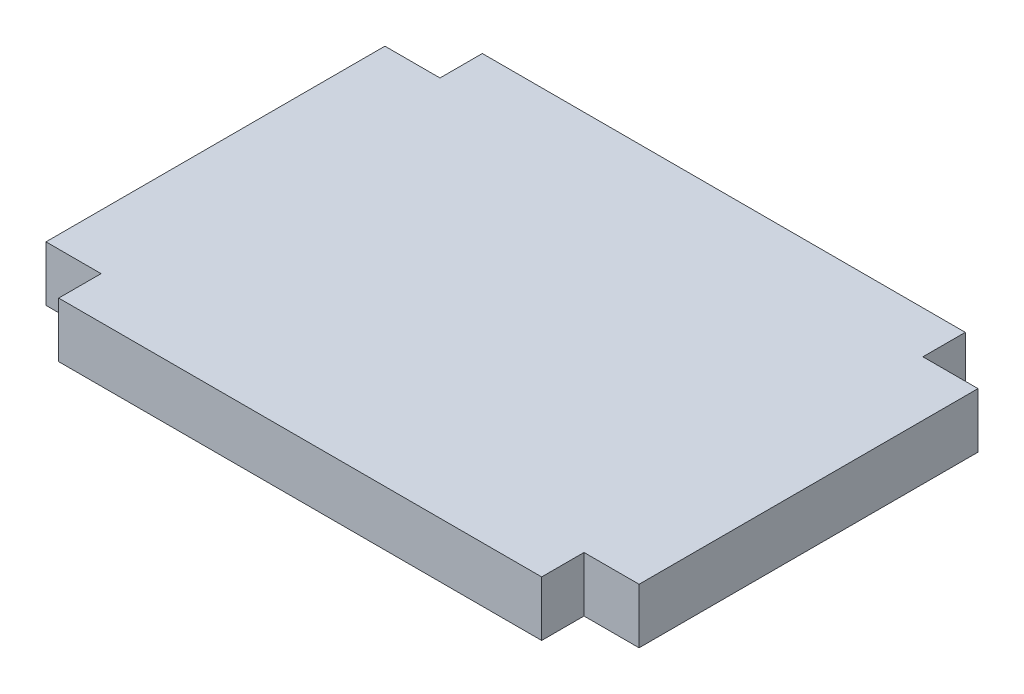
ISO-10303-21;
HEADER;
FILE_DESCRIPTION(('STEP AP214'),'2;1');
FILE_NAME('part.step','',(''),(''),'','','');
FILE_SCHEMA(('AUTOMOTIVE_DESIGN { 1 0 10303 214 1 1 1 1 }'));
ENDSEC;
DATA;
#1=APPLICATION_CONTEXT('core data for automotive mechanical design processes');
#2=APPLICATION_PROTOCOL_DEFINITION('international standard','automotive_design',2000,#1);
#3=PRODUCT_CONTEXT('',#1,'mechanical');
#4=PRODUCT('Part','Part','',(#3));
#5=PRODUCT_RELATED_PRODUCT_CATEGORY('part','',(#4));
#6=PRODUCT_DEFINITION_FORMATION('','',#4);
#7=PRODUCT_DEFINITION_CONTEXT('part definition',#1,'design');
#8=PRODUCT_DEFINITION('design','',#6,#7);
#9=PRODUCT_DEFINITION_SHAPE('','',#8);
#10=(LENGTH_UNIT() NAMED_UNIT(*) SI_UNIT(.MILLI.,.METRE.));
#11=(NAMED_UNIT(*) PLANE_ANGLE_UNIT() SI_UNIT($,.RADIAN.));
#12=(NAMED_UNIT(*) SI_UNIT($,.STERADIAN.) SOLID_ANGLE_UNIT());
#13=UNCERTAINTY_MEASURE_WITH_UNIT(LENGTH_MEASURE(1.E-05),#10,'distance_accuracy_value','');
#14=(GEOMETRIC_REPRESENTATION_CONTEXT(3) GLOBAL_UNCERTAINTY_ASSIGNED_CONTEXT((#13)) GLOBAL_UNIT_ASSIGNED_CONTEXT((#10,
#11,#12)) REPRESENTATION_CONTEXT('',''));
#15=CARTESIAN_POINT('',(0.,0.,0.));
#16=DIRECTION('',(0.,0.,1.));
#17=DIRECTION('',(1.,0.,0.));
#18=AXIS2_PLACEMENT_3D('',#15,#16,#17);
#19=CARTESIAN_POINT('',(5.7,1.3,-5.));
#20=DIRECTION('',(-1.,0.,0.));
#21=DIRECTION('',(0.,0.,1.));
#22=AXIS2_PLACEMENT_3D('',#19,#20,#21);
#23=PLANE('',#22);
#24=DIRECTION('',(0.,1.,0.));
#25=VECTOR('',#24,1.);
#26=CARTESIAN_POINT('',(5.7,0.,-4.));
#27=LINE('',#26,#25);
#28=CARTESIAN_POINT('',(5.7,0.,-4.));
#29=VERTEX_POINT('',#28);
#30=CARTESIAN_POINT('',(5.7,1.3,-4.));
#31=VERTEX_POINT('',#30);
#32=EDGE_CURVE('E133',#29,#31,#27,.T.);
#33=ORIENTED_EDGE('',*,*,#32,.F.);
#34=DIRECTION('',(0.,0.,-1.));
#35=VECTOR('',#34,1.);
#36=CARTESIAN_POINT('',(5.7,0.,-5.));
#37=LINE('',#36,#35);
#38=CARTESIAN_POINT('',(5.7,0.,-5.));
#39=VERTEX_POINT('',#38);
#40=EDGE_CURVE('E186',#29,#39,#37,.T.);
#41=ORIENTED_EDGE('',*,*,#40,.T.);
#42=DIRECTION('',(0.,-1.,0.));
#43=VECTOR('',#42,1.);
#44=CARTESIAN_POINT('',(5.7,1.3,-5.));
#45=LINE('',#44,#43);
#46=CARTESIAN_POINT('',(5.7,1.3,-5.));
#47=VERTEX_POINT('',#46);
#48=EDGE_CURVE('E11',#47,#39,#45,.T.);
#49=ORIENTED_EDGE('',*,*,#48,.F.);
#50=DIRECTION('',(0.,0.,-1.));
#51=VECTOR('',#50,1.);
#52=CARTESIAN_POINT('',(5.7,1.3,-5.));
#53=LINE('',#52,#51);
#54=EDGE_CURVE('E149',#31,#47,#53,.T.);
#55=ORIENTED_EDGE('',*,*,#54,.F.);
#56=EDGE_LOOP('',(#33,#41,#49,#55));
#57=FACE_BOUND('',#56,.T.);
#58=ADVANCED_FACE('F43',(#57),#23,.F.);
#59=CARTESIAN_POINT('',(-5.7,1.3,-5.));
#60=DIRECTION('',(1.,0.,0.));
#61=DIRECTION('',(0.,0.,-1.));
#62=AXIS2_PLACEMENT_3D('',#59,#60,#61);
#63=PLANE('',#62);
#64=DIRECTION('',(0.,1.,0.));
#65=VECTOR('',#64,1.);
#66=CARTESIAN_POINT('',(-5.7,0.,4.));
#67=LINE('',#66,#65);
#68=CARTESIAN_POINT('',(-5.7,0.,4.));
#69=VERTEX_POINT('',#68);
#70=CARTESIAN_POINT('',(-5.7,1.3,4.));
#71=VERTEX_POINT('',#70);
#72=EDGE_CURVE('E238',#69,#71,#67,.T.);
#73=ORIENTED_EDGE('',*,*,#72,.F.);
#74=DIRECTION('',(0.,0.,1.));
#75=VECTOR('',#74,1.);
#76=CARTESIAN_POINT('',(-5.7,0.,-5.));
#77=LINE('',#76,#75);
#78=CARTESIAN_POINT('',(-5.7,0.,5.));
#79=VERTEX_POINT('',#78);
#80=EDGE_CURVE('E189',#69,#79,#77,.T.);
#81=ORIENTED_EDGE('',*,*,#80,.T.);
#82=DIRECTION('',(0.,-1.,0.));
#83=VECTOR('',#82,1.);
#84=CARTESIAN_POINT('',(-5.7,1.3,5.));
#85=LINE('',#84,#83);
#86=CARTESIAN_POINT('',(-5.7,1.3,5.));
#87=VERTEX_POINT('',#86);
#88=EDGE_CURVE('E196',#87,#79,#85,.T.);
#89=ORIENTED_EDGE('',*,*,#88,.F.);
#90=DIRECTION('',(0.,0.,1.));
#91=VECTOR('',#90,1.);
#92=CARTESIAN_POINT('',(-5.7,1.3,-5.));
#93=LINE('',#92,#91);
#94=EDGE_CURVE('E172',#71,#87,#93,.T.);
#95=ORIENTED_EDGE('',*,*,#94,.F.);
#96=EDGE_LOOP('',(#73,#81,#89,#95));
#97=FACE_BOUND('',#96,.T.);
#98=ADVANCED_FACE('F255',(#97),#63,.F.);
#99=CARTESIAN_POINT('',(5.7,0.,5.));
#100=VERTEX_POINT('',#99);
#101=CARTESIAN_POINT('',(5.7,0.,4.));
#102=VERTEX_POINT('',#101);
#103=EDGE_CURVE('E181',#100,#102,#37,.T.);
#104=ORIENTED_EDGE('',*,*,#103,.T.);
#105=DIRECTION('',(0.,1.,0.));
#106=VECTOR('',#105,1.);
#107=CARTESIAN_POINT('',(5.7,0.,4.));
#108=LINE('',#107,#106);
#109=CARTESIAN_POINT('',(5.7,1.3,4.));
#110=VERTEX_POINT('',#109);
#111=EDGE_CURVE('E421',#102,#110,#108,.T.);
#112=ORIENTED_EDGE('',*,*,#111,.T.);
#113=CARTESIAN_POINT('',(5.7,1.3,5.));
#114=VERTEX_POINT('',#113);
#115=EDGE_CURVE('E158',#114,#110,#53,.T.);
#116=ORIENTED_EDGE('',*,*,#115,.F.);
#117=DIRECTION('',(0.,-1.,0.));
#118=VECTOR('',#117,1.);
#119=CARTESIAN_POINT('',(5.7,1.3,5.));
#120=LINE('',#119,#118);
#121=EDGE_CURVE('E180',#114,#100,#120,.T.);
#122=ORIENTED_EDGE('',*,*,#121,.T.);
#123=EDGE_LOOP('',(#104,#112,#116,#122));
#124=FACE_BOUND('',#123,.T.);
#125=ADVANCED_FACE('F45',(#124),#23,.F.);
#126=CARTESIAN_POINT('',(-5.7,1.3,-5.));
#127=DIRECTION('',(0.,0.,1.));
#128=DIRECTION('',(1.,0.,0.));
#129=AXIS2_PLACEMENT_3D('',#126,#127,#128);
#130=PLANE('',#129);
#131=DIRECTION('',(-1.,0.,0.));
#132=VECTOR('',#131,1.);
#133=CARTESIAN_POINT('',(-5.7,0.,-5.));
#134=LINE('',#133,#132);
#135=CARTESIAN_POINT('',(-5.7,0.,-5.));
#136=VERTEX_POINT('',#135);
#137=EDGE_CURVE('E185',#39,#136,#134,.T.);
#138=ORIENTED_EDGE('',*,*,#137,.T.);
#139=DIRECTION('',(0.,-1.,0.));
#140=VECTOR('',#139,1.);
#141=CARTESIAN_POINT('',(-5.7,1.3,-5.));
#142=LINE('',#141,#140);
#143=CARTESIAN_POINT('',(-5.7,1.3,-5.));
#144=VERTEX_POINT('',#143);
#145=EDGE_CURVE('E52',#144,#136,#142,.T.);
#146=ORIENTED_EDGE('',*,*,#145,.F.);
#147=DIRECTION('',(-1.,0.,0.));
#148=VECTOR('',#147,1.);
#149=CARTESIAN_POINT('',(-5.7,1.3,-5.));
#150=LINE('',#149,#148);
#151=EDGE_CURVE('E163',#47,#144,#150,.T.);
#152=ORIENTED_EDGE('',*,*,#151,.F.);
#153=ORIENTED_EDGE('',*,*,#48,.T.);
#154=EDGE_LOOP('',(#138,#146,#152,#153));
#155=FACE_BOUND('',#154,.T.);
#156=ADVANCED_FACE('F247',(#155),#130,.F.);
#157=CARTESIAN_POINT('',(-5.7,0.,-4.));
#158=VERTEX_POINT('',#157);
#159=EDGE_CURVE('E164',#136,#158,#77,.T.);
#160=ORIENTED_EDGE('',*,*,#159,.T.);
#161=DIRECTION('',(0.,1.,0.));
#162=VECTOR('',#161,1.);
#163=CARTESIAN_POINT('',(-5.7,0.,-4.));
#164=LINE('',#163,#162);
#165=CARTESIAN_POINT('',(-5.7,1.3,-4.));
#166=VERTEX_POINT('',#165);
#167=EDGE_CURVE('E168',#158,#166,#164,.T.);
#168=ORIENTED_EDGE('',*,*,#167,.T.);
#169=EDGE_CURVE('E173',#144,#166,#93,.T.);
#170=ORIENTED_EDGE('',*,*,#169,.F.);
#171=ORIENTED_EDGE('',*,*,#145,.T.);
#172=EDGE_LOOP('',(#160,#168,#170,#171));
#173=FACE_BOUND('',#172,.T.);
#174=ADVANCED_FACE('F205',(#173),#63,.F.);
#175=CARTESIAN_POINT('',(-5.7,1.3,5.));
#176=DIRECTION('',(0.,0.,-1.));
#177=DIRECTION('',(-1.,0.,0.));
#178=AXIS2_PLACEMENT_3D('',#175,#176,#177);
#179=PLANE('',#178);
#180=DIRECTION('',(1.,0.,0.));
#181=VECTOR('',#180,1.);
#182=CARTESIAN_POINT('',(-5.7,0.,5.));
#183=LINE('',#182,#181);
#184=EDGE_CURVE('E159',#79,#100,#183,.T.);
#185=ORIENTED_EDGE('',*,*,#184,.T.);
#186=ORIENTED_EDGE('',*,*,#121,.F.);
#187=DIRECTION('',(1.,0.,0.));
#188=VECTOR('',#187,1.);
#189=CARTESIAN_POINT('',(-5.7,1.3,5.));
#190=LINE('',#189,#188);
#191=EDGE_CURVE('E177',#87,#114,#190,.T.);
#192=ORIENTED_EDGE('',*,*,#191,.F.);
#193=ORIENTED_EDGE('',*,*,#88,.T.);
#194=EDGE_LOOP('',(#185,#186,#192,#193));
#195=FACE_BOUND('',#194,.T.);
#196=ADVANCED_FACE('F253',(#195),#179,.F.);
#197=CARTESIAN_POINT('',(0.,1.3,0.));
#198=DIRECTION('',(0.,1.,0.));
#199=DIRECTION('',(0.,0.,1.));
#200=AXIS2_PLACEMENT_3D('',#197,#198,#199);
#201=PLANE('',#200);
#202=ORIENTED_EDGE('',*,*,#115,.T.);
#203=DIRECTION('',(1.,0.,0.));
#204=VECTOR('',#203,1.);
#205=CARTESIAN_POINT('',(5.7,1.3,4.));
#206=LINE('',#205,#204);
#207=CARTESIAN_POINT('',(7.,1.3,4.));
#208=VERTEX_POINT('',#207);
#209=EDGE_CURVE('E59',#110,#208,#206,.T.);
#210=ORIENTED_EDGE('',*,*,#209,.T.);
#211=DIRECTION('',(0.,0.,-1.));
#212=VECTOR('',#211,1.);
#213=CARTESIAN_POINT('',(7.,1.3,-4.));
#214=LINE('',#213,#212);
#215=CARTESIAN_POINT('',(7.,1.3,-4.));
#216=VERTEX_POINT('',#215);
#217=EDGE_CURVE('E152',#208,#216,#214,.T.);
#218=ORIENTED_EDGE('',*,*,#217,.T.);
#219=DIRECTION('',(-1.,0.,0.));
#220=VECTOR('',#219,1.);
#221=CARTESIAN_POINT('',(5.7,1.3,-4.));
#222=LINE('',#221,#220);
#223=EDGE_CURVE('E136',#216,#31,#222,.T.);
#224=ORIENTED_EDGE('',*,*,#223,.T.);
#225=ORIENTED_EDGE('',*,*,#54,.T.);
#226=ORIENTED_EDGE('',*,*,#151,.T.);
#227=ORIENTED_EDGE('',*,*,#169,.T.);
#228=DIRECTION('',(-1.,0.,0.));
#229=VECTOR('',#228,1.);
#230=CARTESIAN_POINT('',(-5.7,1.3,-4.));
#231=LINE('',#230,#229);
#232=CARTESIAN_POINT('',(-7.,1.3,-4.));
#233=VERTEX_POINT('',#232);
#234=EDGE_CURVE('E67',#166,#233,#231,.T.);
#235=ORIENTED_EDGE('',*,*,#234,.T.);
#236=DIRECTION('',(0.,0.,1.));
#237=VECTOR('',#236,1.);
#238=CARTESIAN_POINT('',(-7.,1.3,-4.));
#239=LINE('',#238,#237);
#240=CARTESIAN_POINT('',(-7.,1.3,4.));
#241=VERTEX_POINT('',#240);
#242=EDGE_CURVE('E226',#233,#241,#239,.T.);
#243=ORIENTED_EDGE('',*,*,#242,.T.);
#244=DIRECTION('',(1.,0.,0.));
#245=VECTOR('',#244,1.);
#246=CARTESIAN_POINT('',(-5.7,1.3,4.));
#247=LINE('',#246,#245);
#248=EDGE_CURVE('E219',#241,#71,#247,.T.);
#249=ORIENTED_EDGE('',*,*,#248,.T.);
#250=ORIENTED_EDGE('',*,*,#94,.T.);
#251=ORIENTED_EDGE('',*,*,#191,.T.);
#252=EDGE_LOOP('',(#202,#210,#218,#224,#225,#226,#227,#235,#243,#249,#250,#251));
#253=FACE_BOUND('',#252,.T.);
#254=ADVANCED_FACE('F148',(#253),#201,.T.);
#255=CARTESIAN_POINT('',(0.,0.,0.));
#256=DIRECTION('',(0.,1.,0.));
#257=DIRECTION('',(0.,0.,1.));
#258=AXIS2_PLACEMENT_3D('',#255,#256,#257);
#259=PLANE('',#258);
#260=ORIENTED_EDGE('',*,*,#103,.F.);
#261=ORIENTED_EDGE('',*,*,#184,.F.);
#262=ORIENTED_EDGE('',*,*,#80,.F.);
#263=DIRECTION('',(1.,0.,0.));
#264=VECTOR('',#263,1.);
#265=CARTESIAN_POINT('',(-5.7,0.,4.));
#266=LINE('',#265,#264);
#267=CARTESIAN_POINT('',(-7.,0.,4.));
#268=VERTEX_POINT('',#267);
#269=EDGE_CURVE('E223',#268,#69,#266,.T.);
#270=ORIENTED_EDGE('',*,*,#269,.F.);
#271=DIRECTION('',(0.,0.,1.));
#272=VECTOR('',#271,1.);
#273=CARTESIAN_POINT('',(-7.,0.,-4.));
#274=LINE('',#273,#272);
#275=CARTESIAN_POINT('',(-7.,0.,-4.));
#276=VERTEX_POINT('',#275);
#277=EDGE_CURVE('E217',#276,#268,#274,.T.);
#278=ORIENTED_EDGE('',*,*,#277,.F.);
#279=DIRECTION('',(-1.,0.,0.));
#280=VECTOR('',#279,1.);
#281=CARTESIAN_POINT('',(-5.7,0.,-4.));
#282=LINE('',#281,#280);
#283=EDGE_CURVE('E214',#158,#276,#282,.T.);
#284=ORIENTED_EDGE('',*,*,#283,.F.);
#285=ORIENTED_EDGE('',*,*,#159,.F.);
#286=ORIENTED_EDGE('',*,*,#137,.F.);
#287=ORIENTED_EDGE('',*,*,#40,.F.);
#288=DIRECTION('',(-1.,0.,0.));
#289=VECTOR('',#288,1.);
#290=CARTESIAN_POINT('',(5.7,0.,-4.));
#291=LINE('',#290,#289);
#292=CARTESIAN_POINT('',(7.,0.,-4.));
#293=VERTEX_POINT('',#292);
#294=EDGE_CURVE('E138',#293,#29,#291,.T.);
#295=ORIENTED_EDGE('',*,*,#294,.F.);
#296=DIRECTION('',(0.,0.,-1.));
#297=VECTOR('',#296,1.);
#298=CARTESIAN_POINT('',(7.,0.,-4.));
#299=LINE('',#298,#297);
#300=CARTESIAN_POINT('',(7.,0.,4.));
#301=VERTEX_POINT('',#300);
#302=EDGE_CURVE('E420',#301,#293,#299,.T.);
#303=ORIENTED_EDGE('',*,*,#302,.F.);
#304=DIRECTION('',(1.,0.,0.));
#305=VECTOR('',#304,1.);
#306=CARTESIAN_POINT('',(5.7,0.,4.));
#307=LINE('',#306,#305);
#308=EDGE_CURVE('E154',#102,#301,#307,.T.);
#309=ORIENTED_EDGE('',*,*,#308,.F.);
#310=EDGE_LOOP('',(#260,#261,#262,#270,#278,#284,#285,#286,#287,#295,#303,#309));
#311=FACE_BOUND('',#310,.T.);
#312=ADVANCED_FACE('F211',(#311),#259,.F.);
#313=CARTESIAN_POINT('',(-5.7,0.,4.));
#314=DIRECTION('',(0.,0.,1.));
#315=DIRECTION('',(1.,0.,0.));
#316=AXIS2_PLACEMENT_3D('',#313,#314,#315);
#317=PLANE('',#316);
#318=ORIENTED_EDGE('',*,*,#248,.F.);
#319=DIRECTION('',(0.,1.,0.));
#320=VECTOR('',#319,1.);
#321=CARTESIAN_POINT('',(-7.,0.,4.));
#322=LINE('',#321,#320);
#323=EDGE_CURVE('E241',#268,#241,#322,.T.);
#324=ORIENTED_EDGE('',*,*,#323,.F.);
#325=ORIENTED_EDGE('',*,*,#269,.T.);
#326=ORIENTED_EDGE('',*,*,#72,.T.);
#327=EDGE_LOOP('',(#318,#324,#325,#326));
#328=FACE_BOUND('',#327,.T.);
#329=ADVANCED_FACE('F271',(#328),#317,.T.);
#330=CARTESIAN_POINT('',(-7.,0.,-4.));
#331=DIRECTION('',(-1.,0.,0.));
#332=DIRECTION('',(0.,0.,1.));
#333=AXIS2_PLACEMENT_3D('',#330,#331,#332);
#334=PLANE('',#333);
#335=ORIENTED_EDGE('',*,*,#242,.F.);
#336=DIRECTION('',(0.,1.,0.));
#337=VECTOR('',#336,1.);
#338=CARTESIAN_POINT('',(-7.,0.,-4.));
#339=LINE('',#338,#337);
#340=EDGE_CURVE('E243',#276,#233,#339,.T.);
#341=ORIENTED_EDGE('',*,*,#340,.F.);
#342=ORIENTED_EDGE('',*,*,#277,.T.);
#343=ORIENTED_EDGE('',*,*,#323,.T.);
#344=EDGE_LOOP('',(#335,#341,#342,#343));
#345=FACE_BOUND('',#344,.T.);
#346=ADVANCED_FACE('F277',(#345),#334,.T.);
#347=CARTESIAN_POINT('',(-5.7,0.,-4.));
#348=DIRECTION('',(0.,0.,-1.));
#349=DIRECTION('',(-1.,0.,0.));
#350=AXIS2_PLACEMENT_3D('',#347,#348,#349);
#351=PLANE('',#350);
#352=ORIENTED_EDGE('',*,*,#234,.F.);
#353=ORIENTED_EDGE('',*,*,#167,.F.);
#354=ORIENTED_EDGE('',*,*,#283,.T.);
#355=ORIENTED_EDGE('',*,*,#340,.T.);
#356=EDGE_LOOP('',(#352,#353,#354,#355));
#357=FACE_BOUND('',#356,.T.);
#358=ADVANCED_FACE('F274',(#357),#351,.T.);
#359=CARTESIAN_POINT('',(5.7,0.,-4.));
#360=DIRECTION('',(0.,0.,-1.));
#361=DIRECTION('',(-1.,0.,0.));
#362=AXIS2_PLACEMENT_3D('',#359,#360,#361);
#363=PLANE('',#362);
#364=ORIENTED_EDGE('',*,*,#223,.F.);
#365=DIRECTION('',(0.,1.,0.));
#366=VECTOR('',#365,1.);
#367=CARTESIAN_POINT('',(7.,0.,-4.));
#368=LINE('',#367,#366);
#369=EDGE_CURVE('E143',#293,#216,#368,.T.);
#370=ORIENTED_EDGE('',*,*,#369,.F.);
#371=ORIENTED_EDGE('',*,*,#294,.T.);
#372=ORIENTED_EDGE('',*,*,#32,.T.);
#373=EDGE_LOOP('',(#364,#370,#371,#372));
#374=FACE_BOUND('',#373,.T.);
#375=ADVANCED_FACE('F135',(#374),#363,.T.);
#376=CARTESIAN_POINT('',(7.,0.,-4.));
#377=DIRECTION('',(1.,0.,0.));
#378=DIRECTION('',(0.,0.,-1.));
#379=AXIS2_PLACEMENT_3D('',#376,#377,#378);
#380=PLANE('',#379);
#381=ORIENTED_EDGE('',*,*,#217,.F.);
#382=DIRECTION('',(0.,1.,0.));
#383=VECTOR('',#382,1.);
#384=CARTESIAN_POINT('',(7.,0.,4.));
#385=LINE('',#384,#383);
#386=EDGE_CURVE('E411',#301,#208,#385,.T.);
#387=ORIENTED_EDGE('',*,*,#386,.F.);
#388=ORIENTED_EDGE('',*,*,#302,.T.);
#389=ORIENTED_EDGE('',*,*,#369,.T.);
#390=EDGE_LOOP('',(#381,#387,#388,#389));
#391=FACE_BOUND('',#390,.T.);
#392=ADVANCED_FACE('F286',(#391),#380,.T.);
#393=CARTESIAN_POINT('',(5.7,0.,4.));
#394=DIRECTION('',(0.,0.,1.));
#395=DIRECTION('',(1.,0.,0.));
#396=AXIS2_PLACEMENT_3D('',#393,#394,#395);
#397=PLANE('',#396);
#398=ORIENTED_EDGE('',*,*,#209,.F.);
#399=ORIENTED_EDGE('',*,*,#111,.F.);
#400=ORIENTED_EDGE('',*,*,#308,.T.);
#401=ORIENTED_EDGE('',*,*,#386,.T.);
#402=EDGE_LOOP('',(#398,#399,#400,#401));
#403=FACE_BOUND('',#402,.T.);
#404=ADVANCED_FACE('F289',(#403),#397,.T.);
#405=CLOSED_SHELL('',(#58,#98,#125,#156,#174,#196,#254,#312,#329,#346,#358,#375,#392,#404));
#406=MANIFOLD_SOLID_BREP('B2',#405);
#407=ADVANCED_BREP_SHAPE_REPRESENTATION('',(#18,#406),#14);
#408=SHAPE_DEFINITION_REPRESENTATION(#9,#407);
ENDSEC;
END-ISO-10303-21;
